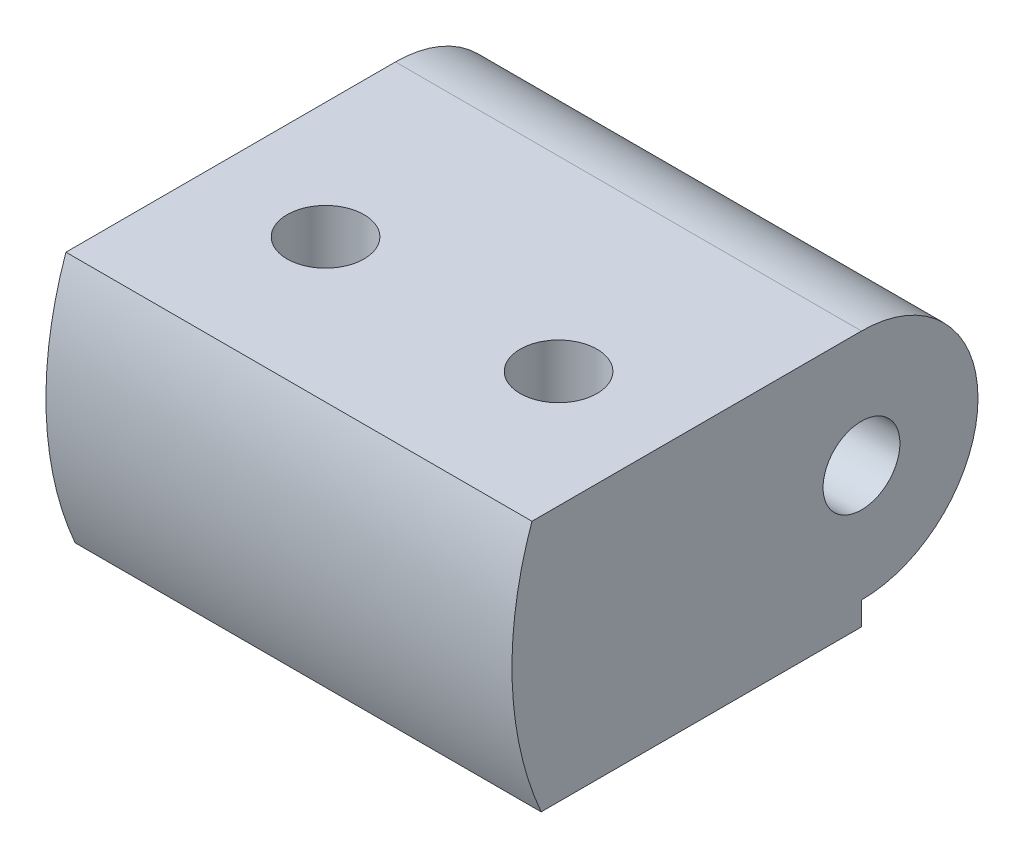
ISO-10303-21;
HEADER;
FILE_DESCRIPTION(('STEP AP214'),'2;1');
FILE_NAME('part.step','',(''),(''),'','','');
FILE_SCHEMA(('AUTOMOTIVE_DESIGN { 1 0 10303 214 1 1 1 1 }'));
ENDSEC;
DATA;
#1=APPLICATION_CONTEXT('core data for automotive mechanical design processes');
#2=APPLICATION_PROTOCOL_DEFINITION('international standard','automotive_design',2000,#1);
#3=PRODUCT_CONTEXT('',#1,'mechanical');
#4=PRODUCT('Part','Part','',(#3));
#5=PRODUCT_RELATED_PRODUCT_CATEGORY('part','',(#4));
#6=PRODUCT_DEFINITION_FORMATION('','',#4);
#7=PRODUCT_DEFINITION_CONTEXT('part definition',#1,'design');
#8=PRODUCT_DEFINITION('design','',#6,#7);
#9=PRODUCT_DEFINITION_SHAPE('','',#8);
#10=(LENGTH_UNIT() NAMED_UNIT(*) SI_UNIT(.MILLI.,.METRE.));
#11=(NAMED_UNIT(*) PLANE_ANGLE_UNIT() SI_UNIT($,.RADIAN.));
#12=(NAMED_UNIT(*) SI_UNIT($,.STERADIAN.) SOLID_ANGLE_UNIT());
#13=UNCERTAINTY_MEASURE_WITH_UNIT(LENGTH_MEASURE(1.E-05),#10,'distance_accuracy_value','');
#14=(GEOMETRIC_REPRESENTATION_CONTEXT(3) GLOBAL_UNCERTAINTY_ASSIGNED_CONTEXT((#13)) GLOBAL_UNIT_ASSIGNED_CONTEXT((#10,
#11,#12)) REPRESENTATION_CONTEXT('',''));
#15=CARTESIAN_POINT('',(0.,0.,0.));
#16=DIRECTION('',(0.,0.,1.));
#17=DIRECTION('',(1.,0.,0.));
#18=AXIS2_PLACEMENT_3D('',#15,#16,#17);
#19=CARTESIAN_POINT('',(10.,10.,10.));
#20=DIRECTION('',(-1.,0.,0.));
#21=DIRECTION('',(0.,0.,1.));
#22=AXIS2_PLACEMENT_3D('',#19,#20,#21);
#23=PLANE('',#22);
#24=CARTESIAN_POINT('',(10.,5.,-5.));
#25=DIRECTION('',(1.,0.,0.));
#26=DIRECTION('',(0.,0.,-1.));
#27=AXIS2_PLACEMENT_3D('',#24,#25,#26);
#28=CIRCLE('',#27,1.65);
#29=CARTESIAN_POINT('',(10.,5.,-6.65));
#30=VERTEX_POINT('',#29);
#31=EDGE_CURVE('E159',#30,#30,#28,.T.);
#32=ORIENTED_EDGE('',*,*,#31,.F.);
#33=EDGE_LOOP('',(#32));
#34=FACE_BOUND('',#33,.T.);
#35=CARTESIAN_POINT('',(10.,5.,-5.));
#36=DIRECTION('',(1.,0.,0.));
#37=DIRECTION('',(0.,0.,-1.));
#38=AXIS2_PLACEMENT_3D('',#35,#36,#37);
#39=CIRCLE('',#38,15.);
#40=CARTESIAN_POINT('',(10.,10.,9.14213562373095));
#41=VERTEX_POINT('',#40);
#42=CARTESIAN_POINT('',(10.,-1.,8.74772708486752));
#43=VERTEX_POINT('',#42);
#44=EDGE_CURVE('E126',#41,#43,#39,.T.);
#45=ORIENTED_EDGE('',*,*,#44,.T.);
#46=DIRECTION('',(0.,0.,1.));
#47=VECTOR('',#46,1.);
#48=CARTESIAN_POINT('',(10.,-1.,10.));
#49=LINE('',#48,#47);
#50=CARTESIAN_POINT('',(10.,-1.,-5.));
#51=VERTEX_POINT('',#50);
#52=EDGE_CURVE('E133',#51,#43,#49,.T.);
#53=ORIENTED_EDGE('',*,*,#52,.F.);
#54=DIRECTION('',(0.,1.,0.));
#55=VECTOR('',#54,1.);
#56=CARTESIAN_POINT('',(10.,-1.,-5.));
#57=LINE('',#56,#55);
#58=CARTESIAN_POINT('',(10.,0.,-5.));
#59=VERTEX_POINT('',#58);
#60=EDGE_CURVE('E154',#51,#59,#57,.T.);
#61=ORIENTED_EDGE('',*,*,#60,.T.);
#62=CARTESIAN_POINT('',(10.,5.,-5.));
#63=DIRECTION('',(-1.,0.,0.));
#64=DIRECTION('',(0.,0.,1.));
#65=AXIS2_PLACEMENT_3D('',#62,#63,#64);
#66=CIRCLE('',#65,5.);
#67=CARTESIAN_POINT('',(10.,5.,-10.));
#68=VERTEX_POINT('',#67);
#69=EDGE_CURVE('E71',#59,#68,#66,.F.);
#70=ORIENTED_EDGE('',*,*,#69,.T.);
#71=CARTESIAN_POINT('',(10.,5.,-5.));
#72=DIRECTION('',(-1.,0.,0.));
#73=DIRECTION('',(0.,0.,1.));
#74=AXIS2_PLACEMENT_3D('',#71,#72,#73);
#75=CIRCLE('',#74,5.);
#76=CARTESIAN_POINT('',(10.,10.,-5.));
#77=VERTEX_POINT('',#76);
#78=EDGE_CURVE('E182',#68,#77,#75,.F.);
#79=ORIENTED_EDGE('',*,*,#78,.T.);
#80=DIRECTION('',(0.,0.,-1.));
#81=VECTOR('',#80,1.);
#82=CARTESIAN_POINT('',(10.,10.,10.));
#83=LINE('',#82,#81);
#84=EDGE_CURVE('E77',#41,#77,#83,.T.);
#85=ORIENTED_EDGE('',*,*,#84,.F.);
#86=EDGE_LOOP('',(#45,#53,#61,#70,#79,#85));
#87=FACE_BOUND('',#86,.T.);
#88=ADVANCED_FACE('F61',(#34,#87),#23,.F.);
#89=CARTESIAN_POINT('',(-10.,10.,10.));
#90=DIRECTION('',(1.,0.,0.));
#91=DIRECTION('',(0.,0.,-1.));
#92=AXIS2_PLACEMENT_3D('',#89,#90,#91);
#93=PLANE('',#92);
#94=CARTESIAN_POINT('',(-10.,5.,-5.));
#95=DIRECTION('',(1.,0.,0.));
#96=DIRECTION('',(0.,0.,-1.));
#97=AXIS2_PLACEMENT_3D('',#94,#95,#96);
#98=CIRCLE('',#97,1.65);
#99=CARTESIAN_POINT('',(-10.,5.,-6.65));
#100=VERTEX_POINT('',#99);
#101=EDGE_CURVE('E163',#100,#100,#98,.T.);
#102=ORIENTED_EDGE('',*,*,#101,.T.);
#103=EDGE_LOOP('',(#102));
#104=FACE_BOUND('',#103,.T.);
#105=DIRECTION('',(0.,0.,-1.));
#106=VECTOR('',#105,1.);
#107=CARTESIAN_POINT('',(-10.,-1.,10.));
#108=LINE('',#107,#106);
#109=CARTESIAN_POINT('',(-10.,-1.,8.74772708486752));
#110=VERTEX_POINT('',#109);
#111=CARTESIAN_POINT('',(-10.,-1.,-5.));
#112=VERTEX_POINT('',#111);
#113=EDGE_CURVE('E130',#110,#112,#108,.T.);
#114=ORIENTED_EDGE('',*,*,#113,.F.);
#115=CARTESIAN_POINT('',(-10.,5.,-5.));
#116=DIRECTION('',(1.,0.,0.));
#117=DIRECTION('',(0.,0.,-1.));
#118=AXIS2_PLACEMENT_3D('',#115,#116,#117);
#119=CIRCLE('',#118,15.);
#120=CARTESIAN_POINT('',(-10.,10.,9.14213562373095));
#121=VERTEX_POINT('',#120);
#122=EDGE_CURVE('E115',#121,#110,#119,.T.);
#123=ORIENTED_EDGE('',*,*,#122,.F.);
#124=DIRECTION('',(0.,0.,1.));
#125=VECTOR('',#124,1.);
#126=CARTESIAN_POINT('',(-10.,10.,10.));
#127=LINE('',#126,#125);
#128=CARTESIAN_POINT('',(-10.,10.,-5.));
#129=VERTEX_POINT('',#128);
#130=EDGE_CURVE('E169',#129,#121,#127,.T.);
#131=ORIENTED_EDGE('',*,*,#130,.F.);
#132=CARTESIAN_POINT('',(-10.,5.,-5.));
#133=DIRECTION('',(1.,0.,0.));
#134=DIRECTION('',(0.,0.,-1.));
#135=AXIS2_PLACEMENT_3D('',#132,#133,#134);
#136=CIRCLE('',#135,5.);
#137=CARTESIAN_POINT('',(-10.,5.,-10.));
#138=VERTEX_POINT('',#137);
#139=EDGE_CURVE('E172',#129,#138,#136,.F.);
#140=ORIENTED_EDGE('',*,*,#139,.T.);
#141=CARTESIAN_POINT('',(-10.,5.,-5.));
#142=DIRECTION('',(1.,0.,0.));
#143=DIRECTION('',(0.,0.,-1.));
#144=AXIS2_PLACEMENT_3D('',#141,#142,#143);
#145=CIRCLE('',#144,5.);
#146=CARTESIAN_POINT('',(-10.,0.,-5.));
#147=VERTEX_POINT('',#146);
#148=EDGE_CURVE('E175',#138,#147,#145,.F.);
#149=ORIENTED_EDGE('',*,*,#148,.T.);
#150=DIRECTION('',(0.,1.,0.));
#151=VECTOR('',#150,1.);
#152=CARTESIAN_POINT('',(-10.,-1.,-5.));
#153=LINE('',#152,#151);
#154=EDGE_CURVE('E139',#112,#147,#153,.T.);
#155=ORIENTED_EDGE('',*,*,#154,.F.);
#156=EDGE_LOOP('',(#114,#123,#131,#140,#149,#155));
#157=FACE_BOUND('',#156,.T.);
#158=ADVANCED_FACE('F137',(#104,#157),#93,.F.);
#159=CARTESIAN_POINT('',(0.,-1.,0.));
#160=DIRECTION('',(0.,-1.,0.));
#161=DIRECTION('',(0.,0.,-1.));
#162=AXIS2_PLACEMENT_3D('',#159,#160,#161);
#163=PLANE('',#162);
#164=CARTESIAN_POINT('',(-5.,-0.999999999999999,3.));
#165=DIRECTION('',(0.,-1.,0.));
#166=DIRECTION('',(0.,0.,-1.));
#167=AXIS2_PLACEMENT_3D('',#164,#165,#166);
#168=CIRCLE('',#167,1.64999999999999);
#169=CARTESIAN_POINT('',(-5.,-0.999999999999999,1.35000000000001));
#170=VERTEX_POINT('',#169);
#171=EDGE_CURVE('E205',#170,#170,#168,.T.);
#172=ORIENTED_EDGE('',*,*,#171,.F.);
#173=EDGE_LOOP('',(#172));
#174=FACE_BOUND('',#173,.T.);
#175=CARTESIAN_POINT('',(5.,-0.999999999999999,3.));
#176=DIRECTION('',(0.,-1.,0.));
#177=DIRECTION('',(0.,0.,-1.));
#178=AXIS2_PLACEMENT_3D('',#175,#176,#177);
#179=CIRCLE('',#178,1.64999999999999);
#180=CARTESIAN_POINT('',(5.,-0.999999999999999,1.35000000000001));
#181=VERTEX_POINT('',#180);
#182=EDGE_CURVE('E142',#181,#181,#179,.T.);
#183=ORIENTED_EDGE('',*,*,#182,.F.);
#184=EDGE_LOOP('',(#183));
#185=FACE_BOUND('',#184,.T.);
#186=ORIENTED_EDGE('',*,*,#52,.T.);
#187=DIRECTION('',(1.,0.,0.));
#188=VECTOR('',#187,1.);
#189=CARTESIAN_POINT('',(-10.,-1.,8.74772708486752));
#190=LINE('',#189,#188);
#191=EDGE_CURVE('E118',#110,#43,#190,.T.);
#192=ORIENTED_EDGE('',*,*,#191,.F.);
#193=ORIENTED_EDGE('',*,*,#113,.T.);
#194=DIRECTION('',(1.,0.,0.));
#195=VECTOR('',#194,1.);
#196=CARTESIAN_POINT('',(-10.,-1.,-5.));
#197=LINE('',#196,#195);
#198=EDGE_CURVE('E141',#112,#51,#197,.T.);
#199=ORIENTED_EDGE('',*,*,#198,.T.);
#200=EDGE_LOOP('',(#186,#192,#193,#199));
#201=FACE_BOUND('',#200,.T.);
#202=ADVANCED_FACE('F129',(#174,#185,#201),#163,.T.);
#203=CARTESIAN_POINT('',(0.,10.,0.));
#204=DIRECTION('',(0.,-1.,0.));
#205=DIRECTION('',(0.,0.,-1.));
#206=AXIS2_PLACEMENT_3D('',#203,#204,#205);
#207=PLANE('',#206);
#208=CARTESIAN_POINT('',(-5.,10.,3.));
#209=DIRECTION('',(0.,1.,0.));
#210=DIRECTION('',(0.,0.,1.));
#211=AXIS2_PLACEMENT_3D('',#208,#209,#210);
#212=CIRCLE('',#211,1.64999999999999);
#213=CARTESIAN_POINT('',(-5.,10.,4.64999999999999));
#214=VERTEX_POINT('',#213);
#215=EDGE_CURVE('E201',#214,#214,#212,.T.);
#216=ORIENTED_EDGE('',*,*,#215,.F.);
#217=EDGE_LOOP('',(#216));
#218=FACE_BOUND('',#217,.T.);
#219=CARTESIAN_POINT('',(5.,10.,3.));
#220=DIRECTION('',(0.,1.,0.));
#221=DIRECTION('',(0.,0.,1.));
#222=AXIS2_PLACEMENT_3D('',#219,#220,#221);
#223=CIRCLE('',#222,1.64999999999999);
#224=CARTESIAN_POINT('',(5.,10.,4.64999999999999));
#225=VERTEX_POINT('',#224);
#226=EDGE_CURVE('E148',#225,#225,#223,.T.);
#227=ORIENTED_EDGE('',*,*,#226,.F.);
#228=EDGE_LOOP('',(#227));
#229=FACE_BOUND('',#228,.T.);
#230=DIRECTION('',(1.,0.,0.));
#231=VECTOR('',#230,1.);
#232=CARTESIAN_POINT('',(-10.,10.,9.14213562373095));
#233=LINE('',#232,#231);
#234=EDGE_CURVE('E120',#121,#41,#233,.T.);
#235=ORIENTED_EDGE('',*,*,#234,.T.);
#236=ORIENTED_EDGE('',*,*,#84,.T.);
#237=DIRECTION('',(-1.,0.,0.));
#238=VECTOR('',#237,1.);
#239=CARTESIAN_POINT('',(0.,10.,-5.));
#240=LINE('',#239,#238);
#241=EDGE_CURVE('E12',#77,#129,#240,.T.);
#242=ORIENTED_EDGE('',*,*,#241,.T.);
#243=ORIENTED_EDGE('',*,*,#130,.T.);
#244=EDGE_LOOP('',(#235,#236,#242,#243));
#245=FACE_BOUND('',#244,.T.);
#246=ADVANCED_FACE('F215',(#218,#229,#245),#207,.F.);
#247=CARTESIAN_POINT('',(0.,5.,-5.));
#248=DIRECTION('',(-1.,0.,0.));
#249=DIRECTION('',(0.,0.,1.));
#250=AXIS2_PLACEMENT_3D('',#247,#248,#249);
#251=CYLINDRICAL_SURFACE('',#250,5.);
#252=ORIENTED_EDGE('',*,*,#241,.F.);
#253=ORIENTED_EDGE('',*,*,#78,.F.);
#254=DIRECTION('',(-1.,0.,0.));
#255=VECTOR('',#254,1.);
#256=CARTESIAN_POINT('',(-10.,5.,-10.));
#257=LINE('',#256,#255);
#258=EDGE_CURVE('E65',#138,#68,#257,.F.);
#259=ORIENTED_EDGE('',*,*,#258,.F.);
#260=ORIENTED_EDGE('',*,*,#139,.F.);
#261=EDGE_LOOP('',(#252,#253,#259,#260));
#262=FACE_BOUND('',#261,.T.);
#263=ADVANCED_FACE('F63',(#262),#251,.T.);
#264=CARTESIAN_POINT('',(-10.,5.,-5.));
#265=DIRECTION('',(1.,0.,0.));
#266=DIRECTION('',(0.,0.,-1.));
#267=AXIS2_PLACEMENT_3D('',#264,#265,#266);
#268=CYLINDRICAL_SURFACE('',#267,5.);
#269=ORIENTED_EDGE('',*,*,#69,.F.);
#270=DIRECTION('',(-1.,0.,0.));
#271=VECTOR('',#270,1.);
#272=CARTESIAN_POINT('',(10.,0.,-5.));
#273=LINE('',#272,#271);
#274=EDGE_CURVE('E178',#147,#59,#273,.F.);
#275=ORIENTED_EDGE('',*,*,#274,.F.);
#276=ORIENTED_EDGE('',*,*,#148,.F.);
#277=ORIENTED_EDGE('',*,*,#258,.T.);
#278=EDGE_LOOP('',(#269,#275,#276,#277));
#279=FACE_BOUND('',#278,.T.);
#280=ADVANCED_FACE('F191',(#279),#268,.T.);
#281=CARTESIAN_POINT('',(10.,5.,-5.));
#282=DIRECTION('',(1.,0.,0.));
#283=DIRECTION('',(0.,0.,-1.));
#284=AXIS2_PLACEMENT_3D('',#281,#282,#283);
#285=CYLINDRICAL_SURFACE('',#284,1.65);
#286=ORIENTED_EDGE('',*,*,#101,.F.);
#287=EDGE_LOOP('',(#286));
#288=FACE_BOUND('',#287,.T.);
#289=ORIENTED_EDGE('',*,*,#31,.T.);
#290=EDGE_LOOP('',(#289));
#291=FACE_BOUND('',#290,.T.);
#292=ADVANCED_FACE('F223',(#288,#291),#285,.F.);
#293=CARTESIAN_POINT('',(-10.,-1.,-5.));
#294=DIRECTION('',(0.,0.,1.));
#295=DIRECTION('',(1.,0.,0.));
#296=AXIS2_PLACEMENT_3D('',#293,#294,#295);
#297=PLANE('',#296);
#298=ORIENTED_EDGE('',*,*,#274,.T.);
#299=ORIENTED_EDGE('',*,*,#60,.F.);
#300=ORIENTED_EDGE('',*,*,#198,.F.);
#301=ORIENTED_EDGE('',*,*,#154,.T.);
#302=EDGE_LOOP('',(#298,#299,#300,#301));
#303=FACE_BOUND('',#302,.T.);
#304=ADVANCED_FACE('F221',(#303),#297,.F.);
#305=CARTESIAN_POINT('',(5.,10.,3.));
#306=DIRECTION('',(0.,1.,0.));
#307=DIRECTION('',(0.,0.,1.));
#308=AXIS2_PLACEMENT_3D('',#305,#306,#307);
#309=CYLINDRICAL_SURFACE('',#308,1.64999999999999);
#310=ORIENTED_EDGE('',*,*,#226,.T.);
#311=EDGE_LOOP('',(#310));
#312=FACE_BOUND('',#311,.T.);
#313=ORIENTED_EDGE('',*,*,#182,.T.);
#314=EDGE_LOOP('',(#313));
#315=FACE_BOUND('',#314,.T.);
#316=ADVANCED_FACE('F212',(#312,#315),#309,.F.);
#317=CARTESIAN_POINT('',(-5.,10.,3.));
#318=DIRECTION('',(0.,1.,0.));
#319=DIRECTION('',(0.,0.,1.));
#320=AXIS2_PLACEMENT_3D('',#317,#318,#319);
#321=CYLINDRICAL_SURFACE('',#320,1.64999999999999);
#322=ORIENTED_EDGE('',*,*,#215,.T.);
#323=EDGE_LOOP('',(#322));
#324=FACE_BOUND('',#323,.T.);
#325=ORIENTED_EDGE('',*,*,#171,.T.);
#326=EDGE_LOOP('',(#325));
#327=FACE_BOUND('',#326,.T.);
#328=ADVANCED_FACE('F229',(#324,#327),#321,.F.);
#329=CARTESIAN_POINT('',(-10.,5.,-5.));
#330=DIRECTION('',(1.,0.,0.));
#331=DIRECTION('',(0.,0.,-1.));
#332=AXIS2_PLACEMENT_3D('',#329,#330,#331);
#333=CYLINDRICAL_SURFACE('',#332,15.);
#334=ORIENTED_EDGE('',*,*,#44,.F.);
#335=ORIENTED_EDGE('',*,*,#234,.F.);
#336=ORIENTED_EDGE('',*,*,#122,.T.);
#337=ORIENTED_EDGE('',*,*,#191,.T.);
#338=EDGE_LOOP('',(#334,#335,#336,#337));
#339=FACE_BOUND('',#338,.T.);
#340=ADVANCED_FACE('F117',(#339),#333,.T.);
#341=CLOSED_SHELL('',(#88,#158,#202,#246,#263,#280,#292,#304,#316,#328,#340));
#342=MANIFOLD_SOLID_BREP('B2',#341);
#343=ADVANCED_BREP_SHAPE_REPRESENTATION('',(#18,#342),#14);
#344=SHAPE_DEFINITION_REPRESENTATION(#9,#343);
ENDSEC;
END-ISO-10303-21;
